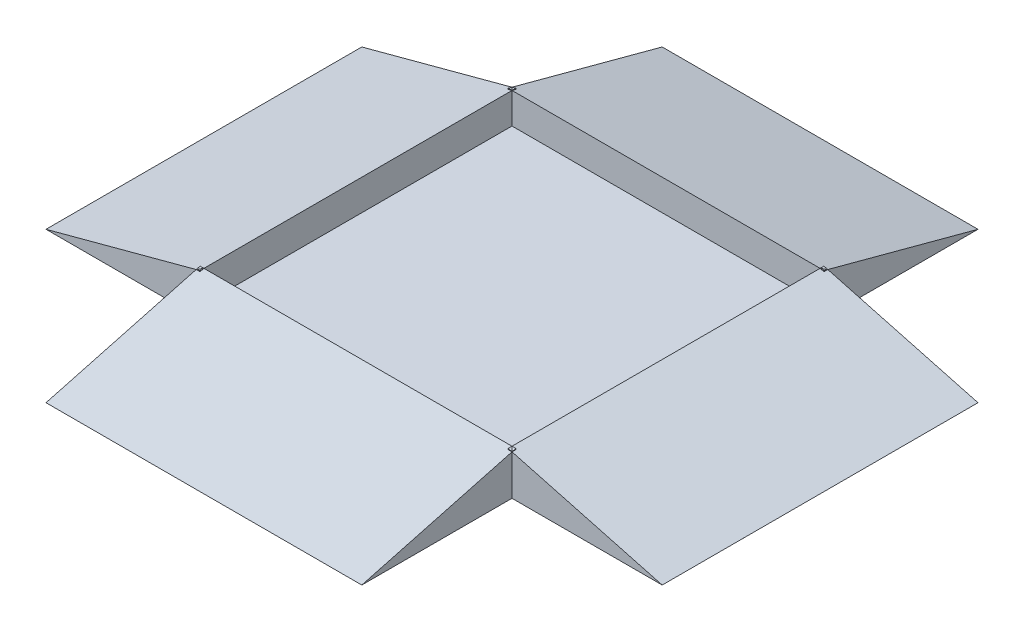
ISO-10303-21;
HEADER;
FILE_DESCRIPTION(('STEP AP214'),'2;1');
FILE_NAME('part.step','',(''),(''),'','','');
FILE_SCHEMA(('AUTOMOTIVE_DESIGN { 1 0 10303 214 1 1 1 1 }'));
ENDSEC;
DATA;
#1=APPLICATION_CONTEXT('core data for automotive mechanical design processes');
#2=APPLICATION_PROTOCOL_DEFINITION('international standard','automotive_design',2000,#1);
#3=PRODUCT_CONTEXT('',#1,'mechanical');
#4=PRODUCT('Part','Part','',(#3));
#5=PRODUCT_RELATED_PRODUCT_CATEGORY('part','',(#4));
#6=PRODUCT_DEFINITION_FORMATION('','',#4);
#7=PRODUCT_DEFINITION_CONTEXT('part definition',#1,'design');
#8=PRODUCT_DEFINITION('design','',#6,#7);
#9=PRODUCT_DEFINITION_SHAPE('','',#8);
#10=(LENGTH_UNIT() NAMED_UNIT(*) SI_UNIT(.MILLI.,.METRE.));
#11=(NAMED_UNIT(*) PLANE_ANGLE_UNIT() SI_UNIT($,.RADIAN.));
#12=(NAMED_UNIT(*) SI_UNIT($,.STERADIAN.) SOLID_ANGLE_UNIT());
#13=UNCERTAINTY_MEASURE_WITH_UNIT(LENGTH_MEASURE(1.E-05),#10,'distance_accuracy_value','');
#14=(GEOMETRIC_REPRESENTATION_CONTEXT(3) GLOBAL_UNCERTAINTY_ASSIGNED_CONTEXT((#13)) GLOBAL_UNIT_ASSIGNED_CONTEXT((#10,
#11,#12)) REPRESENTATION_CONTEXT('',''));
#15=CARTESIAN_POINT('',(0.,0.,0.));
#16=DIRECTION('',(0.,0.,1.));
#17=DIRECTION('',(1.,0.,0.));
#18=AXIS2_PLACEMENT_3D('',#15,#16,#17);
#19=CARTESIAN_POINT('',(102.5,6.79491924311158,0.));
#20=DIRECTION('',(0.,1.,0.));
#21=DIRECTION('',(0.,0.,1.));
#22=AXIS2_PLACEMENT_3D('',#19,#20,#21);
#23=PLANE('',#22);
#24=DIRECTION('',(0.,0.,1.));
#25=VECTOR('',#24,1.);
#26=CARTESIAN_POINT('',(100.000000000001,6.79491924311158,-102.499999999999));
#27=LINE('',#26,#25);
#28=CARTESIAN_POINT('',(100.000000000001,6.79491924311158,-100.));
#29=VERTEX_POINT('',#28);
#30=CARTESIAN_POINT('',(99.999999999999,6.79491924311158,99.9999999999999));
#31=VERTEX_POINT('',#30);
#32=EDGE_CURVE('E205',#29,#31,#27,.T.);
#33=ORIENTED_EDGE('',*,*,#32,.F.);
#34=DIRECTION('',(1.,0.,0.));
#35=VECTOR('',#34,1.);
#36=CARTESIAN_POINT('',(-102.5,6.79491924311158,-100.));
#37=LINE('',#36,#35);
#38=CARTESIAN_POINT('',(-99.9999999999997,6.79491924311158,-100.));
#39=VERTEX_POINT('',#38);
#40=EDGE_CURVE('E255',#39,#29,#37,.T.);
#41=ORIENTED_EDGE('',*,*,#40,.F.);
#42=DIRECTION('',(0.,0.,-1.));
#43=VECTOR('',#42,1.);
#44=CARTESIAN_POINT('',(-100.,6.79491924311158,102.5));
#45=LINE('',#44,#43);
#46=CARTESIAN_POINT('',(-100.,6.79491924311158,100.));
#47=VERTEX_POINT('',#46);
#48=EDGE_CURVE('E316',#47,#39,#45,.T.);
#49=ORIENTED_EDGE('',*,*,#48,.F.);
#50=DIRECTION('',(-1.,0.,0.));
#51=VECTOR('',#50,1.);
#52=CARTESIAN_POINT('',(102.5,6.79491924311158,100.));
#53=LINE('',#52,#51);
#54=EDGE_CURVE('E390',#31,#47,#53,.T.);
#55=ORIENTED_EDGE('',*,*,#54,.F.);
#56=EDGE_LOOP('',(#33,#41,#49,#55));
#57=FACE_BOUND('',#56,.T.);
#58=ADVANCED_FACE('F39',(#57),#23,.T.);
#59=CARTESIAN_POINT('',(102.5,0.,100.));
#60=DIRECTION('',(0.,0.,1.));
#61=DIRECTION('',(1.,0.,0.));
#62=AXIS2_PLACEMENT_3D('',#59,#60,#61);
#63=PLANE('',#62);
#64=DIRECTION('',(0.,-1.,0.));
#65=VECTOR('',#64,1.);
#66=CARTESIAN_POINT('',(-100.,0.,100.));
#67=LINE('',#66,#65);
#68=CARTESIAN_POINT('',(-100.,26.7949192431116,100.));
#69=VERTEX_POINT('',#68);
#70=EDGE_CURVE('E356',#69,#47,#67,.T.);
#71=ORIENTED_EDGE('',*,*,#70,.F.);
#72=DIRECTION('',(-1.,0.,0.));
#73=VECTOR('',#72,1.);
#74=CARTESIAN_POINT('',(102.5,26.7949192431116,100.));
#75=LINE('',#74,#73);
#76=CARTESIAN_POINT('',(99.9999999999989,26.7949192431116,100.));
#77=VERTEX_POINT('',#76);
#78=EDGE_CURVE('E391',#77,#69,#75,.T.);
#79=ORIENTED_EDGE('',*,*,#78,.F.);
#80=DIRECTION('',(0.,1.,0.));
#81=VECTOR('',#80,1.);
#82=CARTESIAN_POINT('',(99.999999999999,0.,100.));
#83=LINE('',#82,#81);
#84=EDGE_CURVE('E352',#31,#77,#83,.T.);
#85=ORIENTED_EDGE('',*,*,#84,.F.);
#86=ORIENTED_EDGE('',*,*,#54,.T.);
#87=EDGE_LOOP('',(#71,#79,#85,#86));
#88=FACE_BOUND('',#87,.T.);
#89=ADVANCED_FACE('F419',(#88),#63,.F.);
#90=CARTESIAN_POINT('',(102.5,49.9999999999989,13.3974596215555));
#91=DIRECTION('',(0.,0.96592582628907,0.258819045102515));
#92=DIRECTION('',(0.,-0.258819045102515,0.96592582628907));
#93=AXIS2_PLACEMENT_3D('',#90,#91,#92);
#94=PLANE('',#93);
#95=ORIENTED_EDGE('',*,*,#78,.T.);
#96=DIRECTION('',(0.,-0.258819045102515,0.96592582628907));
#97=VECTOR('',#96,1.);
#98=CARTESIAN_POINT('',(-100.,49.9999999999991,13.3974596215548));
#99=LINE('',#98,#97);
#100=CARTESIAN_POINT('',(-100.,26.1250462620338,102.5));
#101=VERTEX_POINT('',#100);
#102=EDGE_CURVE('E11',#69,#101,#99,.T.);
#103=ORIENTED_EDGE('',*,*,#102,.T.);
#104=DIRECTION('',(1.,0.,0.));
#105=VECTOR('',#104,1.);
#106=CARTESIAN_POINT('',(102.5,26.1250462620337,102.5));
#107=LINE('',#106,#105);
#108=CARTESIAN_POINT('',(-102.5,26.1250462620339,102.5));
#109=VERTEX_POINT('',#108);
#110=EDGE_CURVE('E331',#109,#101,#107,.T.);
#111=ORIENTED_EDGE('',*,*,#110,.F.);
#112=DIRECTION('',(0.,0.258819045102515,-0.96592582628907));
#113=VECTOR('',#112,1.);
#114=CARTESIAN_POINT('',(-102.5,49.9999999999989,13.3974596215555));
#115=LINE('',#114,#113);
#116=CARTESIAN_POINT('',(-102.5,0.,200.));
#117=VERTEX_POINT('',#116);
#118=EDGE_CURVE('E364',#117,#109,#115,.T.);
#119=ORIENTED_EDGE('',*,*,#118,.F.);
#120=DIRECTION('',(-1.,0.,0.));
#121=VECTOR('',#120,1.);
#122=CARTESIAN_POINT('',(102.5,0.,200.));
#123=LINE('',#122,#121);
#124=CARTESIAN_POINT('',(102.5,0.,200.));
#125=VERTEX_POINT('',#124);
#126=EDGE_CURVE('E373',#125,#117,#123,.T.);
#127=ORIENTED_EDGE('',*,*,#126,.F.);
#128=DIRECTION('',(0.,0.258819045102515,-0.96592582628907));
#129=VECTOR('',#128,1.);
#130=CARTESIAN_POINT('',(102.5,49.9999999999989,13.3974596215555));
#131=LINE('',#130,#129);
#132=CARTESIAN_POINT('',(102.5,26.1250462620335,102.500000000001));
#133=VERTEX_POINT('',#132);
#134=EDGE_CURVE('E369',#125,#133,#131,.T.);
#135=ORIENTED_EDGE('',*,*,#134,.T.);
#136=CARTESIAN_POINT('',(99.9999999999989,26.1250462620335,102.500000000001));
#137=VERTEX_POINT('',#136);
#138=EDGE_CURVE('E335',#137,#133,#107,.T.);
#139=ORIENTED_EDGE('',*,*,#138,.F.);
#140=DIRECTION('',(0.,0.258819045102515,-0.96592582628907));
#141=VECTOR('',#140,1.);
#142=CARTESIAN_POINT('',(99.9999999999999,49.9999999999989,13.3974596215555));
#143=LINE('',#142,#141);
#144=EDGE_CURVE('E48',#137,#77,#143,.T.);
#145=ORIENTED_EDGE('',*,*,#144,.T.);
#146=EDGE_LOOP('',(#95,#103,#111,#119,#127,#135,#139,#145));
#147=FACE_BOUND('',#146,.T.);
#148=ADVANCED_FACE('F411',(#147),#94,.T.);
#149=CARTESIAN_POINT('',(102.5,0.,0.));
#150=DIRECTION('',(1.,0.,0.));
#151=DIRECTION('',(0.,0.,-1.));
#152=AXIS2_PLACEMENT_3D('',#149,#150,#151);
#153=PLANE('',#152);
#154=DIRECTION('',(0.,-1.,0.));
#155=VECTOR('',#154,1.);
#156=CARTESIAN_POINT('',(102.5,0.,102.5));
#157=LINE('',#156,#155);
#158=CARTESIAN_POINT('',(102.5,0.,102.5));
#159=VERTEX_POINT('',#158);
#160=EDGE_CURVE('E334',#133,#159,#157,.T.);
#161=ORIENTED_EDGE('',*,*,#160,.F.);
#162=ORIENTED_EDGE('',*,*,#134,.F.);
#163=DIRECTION('',(0.,0.,1.));
#164=VECTOR('',#163,1.);
#165=CARTESIAN_POINT('',(102.5,0.,0.));
#166=LINE('',#165,#164);
#167=EDGE_CURVE('E360',#159,#125,#166,.T.);
#168=ORIENTED_EDGE('',*,*,#167,.F.);
#169=EDGE_LOOP('',(#161,#162,#168));
#170=FACE_BOUND('',#169,.T.);
#171=ADVANCED_FACE('F542',(#170),#153,.T.);
#172=CARTESIAN_POINT('',(102.5,0.,0.));
#173=DIRECTION('',(0.,-1.,0.));
#174=DIRECTION('',(0.,0.,-1.));
#175=AXIS2_PLACEMENT_3D('',#172,#173,#174);
#176=PLANE('',#175);
#177=DIRECTION('',(0.,0.,1.));
#178=VECTOR('',#177,1.);
#179=CARTESIAN_POINT('',(-102.5,0.,0.));
#180=LINE('',#179,#178);
#181=CARTESIAN_POINT('',(-102.5,0.,102.5));
#182=VERTEX_POINT('',#181);
#183=EDGE_CURVE('E359',#182,#117,#180,.T.);
#184=ORIENTED_EDGE('',*,*,#183,.F.);
#185=DIRECTION('',(-1.,0.,0.));
#186=VECTOR('',#185,1.);
#187=CARTESIAN_POINT('',(-3.57876837231421E-13,0.,102.5));
#188=LINE('',#187,#186);
#189=CARTESIAN_POINT('',(-200.,0.,102.499999999999));
#190=VERTEX_POINT('',#189);
#191=EDGE_CURVE('E288',#182,#190,#188,.T.);
#192=ORIENTED_EDGE('',*,*,#191,.T.);
#193=DIRECTION('',(0.,0.,-1.));
#194=VECTOR('',#193,1.);
#195=CARTESIAN_POINT('',(-200.,0.,102.499999999999));
#196=LINE('',#195,#194);
#197=CARTESIAN_POINT('',(-200.,0.,-102.500000000001));
#198=VERTEX_POINT('',#197);
#199=EDGE_CURVE('E297',#190,#198,#196,.T.);
#200=ORIENTED_EDGE('',*,*,#199,.T.);
#201=DIRECTION('',(-1.,0.,0.));
#202=VECTOR('',#201,1.);
#203=CARTESIAN_POINT('',(3.57876837231421E-13,0.,-102.5));
#204=LINE('',#203,#202);
#205=CARTESIAN_POINT('',(-102.5,0.,-102.5));
#206=VERTEX_POINT('',#205);
#207=EDGE_CURVE('E283',#206,#198,#204,.T.);
#208=ORIENTED_EDGE('',*,*,#207,.F.);
#209=DIRECTION('',(0.,0.,-1.));
#210=VECTOR('',#209,1.);
#211=CARTESIAN_POINT('',(-102.5,0.,0.));
#212=LINE('',#211,#210);
#213=CARTESIAN_POINT('',(-102.5,0.,-200.));
#214=VERTEX_POINT('',#213);
#215=EDGE_CURVE('E497',#206,#214,#212,.T.);
#216=ORIENTED_EDGE('',*,*,#215,.T.);
#217=DIRECTION('',(1.,0.,0.));
#218=VECTOR('',#217,1.);
#219=CARTESIAN_POINT('',(-102.5,0.,-200.));
#220=LINE('',#219,#218);
#221=CARTESIAN_POINT('',(102.5,0.,-200.));
#222=VERTEX_POINT('',#221);
#223=EDGE_CURVE('E505',#214,#222,#220,.T.);
#224=ORIENTED_EDGE('',*,*,#223,.T.);
#225=DIRECTION('',(0.,0.,-1.));
#226=VECTOR('',#225,1.);
#227=CARTESIAN_POINT('',(102.5,0.,0.));
#228=LINE('',#227,#226);
#229=CARTESIAN_POINT('',(102.5,0.,-102.499999999999));
#230=VERTEX_POINT('',#229);
#231=EDGE_CURVE('E241',#230,#222,#228,.T.);
#232=ORIENTED_EDGE('',*,*,#231,.F.);
#233=DIRECTION('',(1.,0.,0.));
#234=VECTOR('',#233,1.);
#235=CARTESIAN_POINT('',(1.07363051169426E-12,0.,-102.5));
#236=LINE('',#235,#234);
#237=CARTESIAN_POINT('',(200.000000000001,0.,-102.499999999998));
#238=VERTEX_POINT('',#237);
#239=EDGE_CURVE('E199',#230,#238,#236,.T.);
#240=ORIENTED_EDGE('',*,*,#239,.T.);
#241=DIRECTION('',(0.,0.,1.));
#242=VECTOR('',#241,1.);
#243=CARTESIAN_POINT('',(200.000000000001,0.,-102.499999999998));
#244=LINE('',#243,#242);
#245=CARTESIAN_POINT('',(199.999999999999,0.,102.500000000002));
#246=VERTEX_POINT('',#245);
#247=EDGE_CURVE('E215',#238,#246,#244,.T.);
#248=ORIENTED_EDGE('',*,*,#247,.T.);
#249=EDGE_CURVE('E284',#246,#159,#188,.T.);
#250=ORIENTED_EDGE('',*,*,#249,.T.);
#251=ORIENTED_EDGE('',*,*,#167,.T.);
#252=ORIENTED_EDGE('',*,*,#126,.T.);
#253=EDGE_LOOP('',(#184,#192,#200,#208,#216,#224,#232,#240,#248,#250,#251,#252));
#254=FACE_BOUND('',#253,.T.);
#255=ADVANCED_FACE('F41',(#254),#176,.T.);
#256=CARTESIAN_POINT('',(-102.5,0.,0.));
#257=DIRECTION('',(1.,0.,0.));
#258=DIRECTION('',(0.,0.,-1.));
#259=AXIS2_PLACEMENT_3D('',#256,#257,#258);
#260=PLANE('',#259);
#261=ORIENTED_EDGE('',*,*,#118,.T.);
#262=DIRECTION('',(0.,-1.,0.));
#263=VECTOR('',#262,1.);
#264=CARTESIAN_POINT('',(-102.5,0.,102.5));
#265=LINE('',#264,#263);
#266=EDGE_CURVE('E395',#109,#182,#265,.T.);
#267=ORIENTED_EDGE('',*,*,#266,.T.);
#268=ORIENTED_EDGE('',*,*,#183,.T.);
#269=EDGE_LOOP('',(#261,#267,#268));
#270=FACE_BOUND('',#269,.T.);
#271=ADVANCED_FACE('F576',(#270),#260,.F.);
#272=CARTESIAN_POINT('',(-102.5,0.,0.));
#273=DIRECTION('',(-1.,0.,0.));
#274=DIRECTION('',(0.,0.,1.));
#275=AXIS2_PLACEMENT_3D('',#272,#273,#274);
#276=PLANE('',#275);
#277=DIRECTION('',(0.,0.258819045102515,0.96592582628907));
#278=VECTOR('',#277,1.);
#279=CARTESIAN_POINT('',(-102.5,49.9999999999989,-13.3974596215555));
#280=LINE('',#279,#278);
#281=CARTESIAN_POINT('',(-102.5,26.1250462620337,-102.5));
#282=VERTEX_POINT('',#281);
#283=CARTESIAN_POINT('',(-102.5,26.7949192431116,-100.));
#284=VERTEX_POINT('',#283);
#285=EDGE_CURVE('E464',#282,#284,#280,.T.);
#286=ORIENTED_EDGE('',*,*,#285,.F.);
#287=DIRECTION('',(0.,0.,1.));
#288=VECTOR('',#287,1.);
#289=CARTESIAN_POINT('',(-102.5,26.1250462620339,102.5));
#290=LINE('',#289,#288);
#291=CARTESIAN_POINT('',(-102.5,26.1250462620337,-100.));
#292=VERTEX_POINT('',#291);
#293=EDGE_CURVE('E268',#282,#292,#290,.T.);
#294=ORIENTED_EDGE('',*,*,#293,.T.);
#295=DIRECTION('',(0.,1.,0.));
#296=VECTOR('',#295,1.);
#297=CARTESIAN_POINT('',(-102.5,0.,-100.));
#298=LINE('',#297,#296);
#299=EDGE_CURVE('E471',#292,#284,#298,.T.);
#300=ORIENTED_EDGE('',*,*,#299,.T.);
#301=EDGE_LOOP('',(#286,#294,#300));
#302=FACE_BOUND('',#301,.T.);
#303=ADVANCED_FACE('F579',(#302),#276,.T.);
#304=CARTESIAN_POINT('',(-102.5,49.9999999999989,-13.3974596215555));
#305=DIRECTION('',(0.,0.96592582628907,-0.258819045102515));
#306=DIRECTION('',(0.,0.258819045102515,0.96592582628907));
#307=AXIS2_PLACEMENT_3D('',#304,#305,#306);
#308=PLANE('',#307);
#309=DIRECTION('',(1.,0.,0.));
#310=VECTOR('',#309,1.);
#311=CARTESIAN_POINT('',(-102.5,26.7949192431116,-100.));
#312=LINE('',#311,#310);
#313=CARTESIAN_POINT('',(-99.9999999999997,26.7949192431116,-100.));
#314=VERTEX_POINT('',#313);
#315=EDGE_CURVE('E262',#284,#314,#312,.T.);
#316=ORIENTED_EDGE('',*,*,#315,.T.);
#317=DIRECTION('',(-0.694746590606865,-0.186156787897381,-0.694746590606868));
#318=VECTOR('',#317,1.);
#319=CARTESIAN_POINT('',(42.5430946428319,64.9892263392905,42.543094642832));
#320=LINE('',#319,#318);
#321=EDGE_CURVE('E271',#314,#282,#320,.T.);
#322=ORIENTED_EDGE('',*,*,#321,.T.);
#323=ORIENTED_EDGE('',*,*,#285,.T.);
#324=EDGE_LOOP('',(#316,#322,#323));
#325=FACE_BOUND('',#324,.T.);
#326=ADVANCED_FACE('F462',(#325),#308,.T.);
#327=CARTESIAN_POINT('',(-102.5,0.,-100.));
#328=DIRECTION('',(0.,0.,-1.));
#329=DIRECTION('',(-1.,0.,0.));
#330=AXIS2_PLACEMENT_3D('',#327,#328,#329);
#331=PLANE('',#330);
#332=DIRECTION('',(-0.96592582628907,-0.258819045102515,0.));
#333=VECTOR('',#332,1.);
#334=CARTESIAN_POINT('',(-13.3974596215558,49.9999999999987,-100.));
#335=LINE('',#334,#333);
#336=EDGE_CURVE('E327',#314,#292,#335,.T.);
#337=ORIENTED_EDGE('',*,*,#336,.F.);
#338=ORIENTED_EDGE('',*,*,#315,.F.);
#339=ORIENTED_EDGE('',*,*,#299,.F.);
#340=EDGE_LOOP('',(#337,#338,#339));
#341=FACE_BOUND('',#340,.T.);
#342=ADVANCED_FACE('F470',(#341),#331,.F.);
#343=CARTESIAN_POINT('',(-100.,0.,102.5));
#344=DIRECTION('',(-1.,0.,0.));
#345=DIRECTION('',(0.,0.,1.));
#346=AXIS2_PLACEMENT_3D('',#343,#344,#345);
#347=PLANE('',#346);
#348=DIRECTION('',(0.,0.,-1.));
#349=VECTOR('',#348,1.);
#350=CARTESIAN_POINT('',(-100.,26.7949192431116,102.5));
#351=LINE('',#350,#349);
#352=CARTESIAN_POINT('',(-99.9999999999996,26.7949192431116,-102.5));
#353=VERTEX_POINT('',#352);
#354=EDGE_CURVE('E311',#314,#353,#351,.T.);
#355=ORIENTED_EDGE('',*,*,#354,.F.);
#356=DIRECTION('',(0.,-0.258819045102515,-0.96592582628907));
#357=VECTOR('',#356,1.);
#358=CARTESIAN_POINT('',(-100.,75.6249999999982,82.236342322397));
#359=LINE('',#358,#357);
#360=CARTESIAN_POINT('',(-99.9999999999996,26.1250462620337,-102.5));
#361=VERTEX_POINT('',#360);
#362=EDGE_CURVE('E275',#314,#361,#359,.T.);
#363=ORIENTED_EDGE('',*,*,#362,.T.);
#364=DIRECTION('',(0.,1.,0.));
#365=VECTOR('',#364,1.);
#366=CARTESIAN_POINT('',(-99.9999999999996,0.,-102.5));
#367=LINE('',#366,#365);
#368=EDGE_CURVE('E300',#361,#353,#367,.T.);
#369=ORIENTED_EDGE('',*,*,#368,.T.);
#370=EDGE_LOOP('',(#355,#363,#369));
#371=FACE_BOUND('',#370,.T.);
#372=ADVANCED_FACE('F450',(#371),#347,.F.);
#373=CARTESIAN_POINT('',(-13.3974596215559,49.9999999999989,102.5));
#374=DIRECTION('',(-0.258819045102515,0.96592582628907,0.));
#375=DIRECTION('',(-0.96592582628907,-0.258819045102515,0.));
#376=AXIS2_PLACEMENT_3D('',#373,#374,#375);
#377=PLANE('',#376);
#378=ORIENTED_EDGE('',*,*,#321,.F.);
#379=ORIENTED_EDGE('',*,*,#354,.T.);
#380=DIRECTION('',(0.96592582628907,0.258819045102515,0.));
#381=VECTOR('',#380,1.);
#382=CARTESIAN_POINT('',(-13.3974596215551,49.9999999999989,-102.5));
#383=LINE('',#382,#381);
#384=EDGE_CURVE('E304',#282,#353,#383,.T.);
#385=ORIENTED_EDGE('',*,*,#384,.F.);
#386=EDGE_LOOP('',(#378,#379,#385));
#387=FACE_BOUND('',#386,.T.);
#388=ADVANCED_FACE('F447',(#387),#377,.T.);
#389=CARTESIAN_POINT('',(3.57876837231421E-13,0.,-102.5));
#390=DIRECTION('',(0.,0.,1.));
#391=DIRECTION('',(1.,0.,0.));
#392=AXIS2_PLACEMENT_3D('',#389,#390,#391);
#393=PLANE('',#392);
#394=ORIENTED_EDGE('',*,*,#368,.F.);
#395=DIRECTION('',(-1.,0.,0.));
#396=VECTOR('',#395,1.);
#397=CARTESIAN_POINT('',(3.334358217674E-13,26.1250462620338,-102.5));
#398=LINE('',#397,#396);
#399=EDGE_CURVE('E323',#361,#282,#398,.T.);
#400=ORIENTED_EDGE('',*,*,#399,.T.);
#401=ORIENTED_EDGE('',*,*,#384,.T.);
#402=EDGE_LOOP('',(#394,#400,#401));
#403=FACE_BOUND('',#402,.T.);
#404=ADVANCED_FACE('F444',(#403),#393,.F.);
#405=CARTESIAN_POINT('',(100.000000000001,26.7949192431116,-100.));
#406=VERTEX_POINT('',#405);
#407=EDGE_CURVE('E456',#314,#406,#312,.T.);
#408=ORIENTED_EDGE('',*,*,#407,.F.);
#409=DIRECTION('',(0.,-1.,0.));
#410=VECTOR('',#409,1.);
#411=CARTESIAN_POINT('',(-99.9999999999997,0.,-100.));
#412=LINE('',#411,#410);
#413=EDGE_CURVE('E279',#314,#39,#412,.T.);
#414=ORIENTED_EDGE('',*,*,#413,.T.);
#415=ORIENTED_EDGE('',*,*,#40,.T.);
#416=DIRECTION('',(0.,-1.,0.));
#417=VECTOR('',#416,1.);
#418=CARTESIAN_POINT('',(100.000000000001,0.,-100.));
#419=LINE('',#418,#417);
#420=EDGE_CURVE('E483',#406,#29,#419,.T.);
#421=ORIENTED_EDGE('',*,*,#420,.F.);
#422=EDGE_LOOP('',(#408,#414,#415,#421));
#423=FACE_BOUND('',#422,.T.);
#424=ADVANCED_FACE('F478',(#423),#331,.F.);
#425=ORIENTED_EDGE('',*,*,#362,.F.);
#426=ORIENTED_EDGE('',*,*,#407,.T.);
#427=DIRECTION('',(0.,-0.258819045102515,-0.96592582628907));
#428=VECTOR('',#427,1.);
#429=CARTESIAN_POINT('',(100.,49.9999999999994,-13.3974596215535));
#430=LINE('',#429,#428);
#431=CARTESIAN_POINT('',(100.000000000001,26.1250462620339,-102.499999999999));
#432=VERTEX_POINT('',#431);
#433=EDGE_CURVE('E202',#406,#432,#430,.T.);
#434=ORIENTED_EDGE('',*,*,#433,.T.);
#435=DIRECTION('',(-1.,0.,0.));
#436=VECTOR('',#435,1.);
#437=CARTESIAN_POINT('',(-102.499999999999,26.1250462620335,-102.500000000001));
#438=LINE('',#437,#436);
#439=CARTESIAN_POINT('',(102.5,26.1250462620341,-102.499999999999));
#440=VERTEX_POINT('',#439);
#441=EDGE_CURVE('E195',#440,#432,#438,.T.);
#442=ORIENTED_EDGE('',*,*,#441,.F.);
#443=DIRECTION('',(0.,0.258819045102515,0.96592582628907));
#444=VECTOR('',#443,1.);
#445=CARTESIAN_POINT('',(102.5,49.9999999999989,-13.3974596215555));
#446=LINE('',#445,#444);
#447=EDGE_CURVE('E500',#222,#440,#446,.T.);
#448=ORIENTED_EDGE('',*,*,#447,.F.);
#449=ORIENTED_EDGE('',*,*,#223,.F.);
#450=EDGE_CURVE('E503',#214,#282,#280,.T.);
#451=ORIENTED_EDGE('',*,*,#450,.T.);
#452=ORIENTED_EDGE('',*,*,#399,.F.);
#453=EDGE_LOOP('',(#425,#426,#434,#442,#448,#449,#451,#452));
#454=FACE_BOUND('',#453,.T.);
#455=ADVANCED_FACE('F454',(#454),#308,.T.);
#456=DIRECTION('',(0.,-1.,0.));
#457=VECTOR('',#456,1.);
#458=CARTESIAN_POINT('',(-102.5,0.,-102.5));
#459=LINE('',#458,#457);
#460=EDGE_CURVE('E319',#282,#206,#459,.T.);
#461=ORIENTED_EDGE('',*,*,#460,.F.);
#462=ORIENTED_EDGE('',*,*,#450,.F.);
#463=ORIENTED_EDGE('',*,*,#215,.F.);
#464=EDGE_LOOP('',(#461,#462,#463));
#465=FACE_BOUND('',#464,.T.);
#466=ADVANCED_FACE('F599',(#465),#276,.T.);
#467=CARTESIAN_POINT('',(102.5,0.,0.));
#468=DIRECTION('',(-1.,0.,0.));
#469=DIRECTION('',(0.,0.,1.));
#470=AXIS2_PLACEMENT_3D('',#467,#468,#469);
#471=PLANE('',#470);
#472=ORIENTED_EDGE('',*,*,#447,.T.);
#473=DIRECTION('',(0.,-1.,0.));
#474=VECTOR('',#473,1.);
#475=CARTESIAN_POINT('',(102.5,0.,-102.499999999999));
#476=LINE('',#475,#474);
#477=EDGE_CURVE('E251',#440,#230,#476,.T.);
#478=ORIENTED_EDGE('',*,*,#477,.T.);
#479=ORIENTED_EDGE('',*,*,#231,.T.);
#480=EDGE_LOOP('',(#472,#478,#479));
#481=FACE_BOUND('',#480,.T.);
#482=ADVANCED_FACE('F612',(#481),#471,.F.);
#483=CARTESIAN_POINT('',(1.07363051169426E-12,0.,-102.5));
#484=DIRECTION('',(0.,0.,-1.));
#485=DIRECTION('',(-1.,0.,0.));
#486=AXIS2_PLACEMENT_3D('',#483,#484,#485);
#487=PLANE('',#486);
#488=ORIENTED_EDGE('',*,*,#477,.F.);
#489=DIRECTION('',(-0.96592582628907,0.258819045102515,0.));
#490=VECTOR('',#489,1.);
#491=CARTESIAN_POINT('',(13.3974596215566,49.9999999999989,-102.5));
#492=LINE('',#491,#490);
#493=EDGE_CURVE('E189',#238,#440,#492,.T.);
#494=ORIENTED_EDGE('',*,*,#493,.F.);
#495=ORIENTED_EDGE('',*,*,#239,.F.);
#496=EDGE_LOOP('',(#488,#494,#495));
#497=FACE_BOUND('',#496,.T.);
#498=ADVANCED_FACE('F250',(#497),#487,.T.);
#499=DIRECTION('',(0.,1.,0.));
#500=VECTOR('',#499,1.);
#501=CARTESIAN_POINT('',(102.5,0.,-100.));
#502=LINE('',#501,#500);
#503=CARTESIAN_POINT('',(102.5,26.1250462620341,-100.));
#504=VERTEX_POINT('',#503);
#505=CARTESIAN_POINT('',(102.5,26.7949192431116,-100.));
#506=VERTEX_POINT('',#505);
#507=EDGE_CURVE('E491',#504,#506,#502,.T.);
#508=ORIENTED_EDGE('',*,*,#507,.F.);
#509=DIRECTION('',(0.,0.,-1.));
#510=VECTOR('',#509,1.);
#511=CARTESIAN_POINT('',(102.5,26.1250462620338,0.));
#512=LINE('',#511,#510);
#513=EDGE_CURVE('E254',#504,#440,#512,.T.);
#514=ORIENTED_EDGE('',*,*,#513,.T.);
#515=EDGE_CURVE('E510',#440,#506,#446,.T.);
#516=ORIENTED_EDGE('',*,*,#515,.T.);
#517=EDGE_LOOP('',(#508,#514,#516));
#518=FACE_BOUND('',#517,.T.);
#519=ADVANCED_FACE('F525',(#518),#471,.F.);
#520=DIRECTION('',(0.69474659060687,-0.18615678789738,-0.694746590606863));
#521=VECTOR('',#520,1.);
#522=CARTESIAN_POINT('',(-42.5430946428326,64.9892263392906,42.5430946428321));
#523=LINE('',#522,#521);
#524=EDGE_CURVE('E185',#406,#440,#523,.T.);
#525=ORIENTED_EDGE('',*,*,#524,.F.);
#526=EDGE_CURVE('E469',#406,#506,#312,.T.);
#527=ORIENTED_EDGE('',*,*,#526,.T.);
#528=ORIENTED_EDGE('',*,*,#515,.F.);
#529=EDGE_LOOP('',(#525,#527,#528));
#530=FACE_BOUND('',#529,.T.);
#531=ADVANCED_FACE('F519',(#530),#308,.T.);
#532=ORIENTED_EDGE('',*,*,#526,.F.);
#533=DIRECTION('',(0.96592582628907,-0.258819045102515,0.));
#534=VECTOR('',#533,1.);
#535=CARTESIAN_POINT('',(-82.2363423223972,75.6249999999986,-100.));
#536=LINE('',#535,#534);
#537=EDGE_CURVE('E487',#406,#504,#536,.T.);
#538=ORIENTED_EDGE('',*,*,#537,.T.);
#539=ORIENTED_EDGE('',*,*,#507,.T.);
#540=EDGE_LOOP('',(#532,#538,#539));
#541=FACE_BOUND('',#540,.T.);
#542=ADVANCED_FACE('F523',(#541),#331,.F.);
#543=CARTESIAN_POINT('',(100.000000000001,0.,-102.499999999999));
#544=DIRECTION('',(1.,0.,0.));
#545=DIRECTION('',(0.,0.,-1.));
#546=AXIS2_PLACEMENT_3D('',#543,#544,#545);
#547=PLANE('',#546);
#548=ORIENTED_EDGE('',*,*,#433,.F.);
#549=DIRECTION('',(0.,0.,1.));
#550=VECTOR('',#549,1.);
#551=CARTESIAN_POINT('',(100.000000000001,26.7949192431116,-102.499999999999));
#552=LINE('',#551,#550);
#553=CARTESIAN_POINT('',(100.000000000001,26.7949192431116,-102.499999999999));
#554=VERTEX_POINT('',#553);
#555=EDGE_CURVE('E182',#554,#406,#552,.T.);
#556=ORIENTED_EDGE('',*,*,#555,.F.);
#557=DIRECTION('',(0.,1.,0.));
#558=VECTOR('',#557,1.);
#559=CARTESIAN_POINT('',(100.000000000001,0.,-102.499999999999));
#560=LINE('',#559,#558);
#561=EDGE_CURVE('E190',#432,#554,#560,.T.);
#562=ORIENTED_EDGE('',*,*,#561,.F.);
#563=EDGE_LOOP('',(#548,#556,#562));
#564=FACE_BOUND('',#563,.T.);
#565=ADVANCED_FACE('F201',(#564),#547,.F.);
#566=CARTESIAN_POINT('',(13.3974596215566,49.9999999999989,-102.5));
#567=DIRECTION('',(0.258819045102515,0.96592582628907,0.));
#568=DIRECTION('',(-0.96592582628907,0.258819045102515,0.));
#569=AXIS2_PLACEMENT_3D('',#566,#567,#568);
#570=PLANE('',#569);
#571=ORIENTED_EDGE('',*,*,#555,.T.);
#572=ORIENTED_EDGE('',*,*,#524,.T.);
#573=EDGE_CURVE('E178',#440,#554,#492,.T.);
#574=ORIENTED_EDGE('',*,*,#573,.T.);
#575=EDGE_LOOP('',(#571,#572,#574));
#576=FACE_BOUND('',#575,.T.);
#577=ADVANCED_FACE('F180',(#576),#570,.T.);
#578=ORIENTED_EDGE('',*,*,#573,.F.);
#579=ORIENTED_EDGE('',*,*,#441,.T.);
#580=ORIENTED_EDGE('',*,*,#561,.T.);
#581=EDGE_LOOP('',(#578,#579,#580));
#582=FACE_BOUND('',#581,.T.);
#583=ADVANCED_FACE('F193',(#582),#487,.T.);
#584=EDGE_CURVE('E305',#198,#282,#383,.T.);
#585=ORIENTED_EDGE('',*,*,#584,.T.);
#586=ORIENTED_EDGE('',*,*,#460,.T.);
#587=ORIENTED_EDGE('',*,*,#207,.T.);
#588=EDGE_LOOP('',(#585,#586,#587));
#589=FACE_BOUND('',#588,.T.);
#590=ADVANCED_FACE('F558',(#589),#393,.F.);
#591=CARTESIAN_POINT('',(-3.57876837231421E-13,0.,102.5));
#592=DIRECTION('',(0.,0.,1.));
#593=DIRECTION('',(1.,0.,0.));
#594=AXIS2_PLACEMENT_3D('',#591,#592,#593);
#595=PLANE('',#594);
#596=ORIENTED_EDGE('',*,*,#266,.F.);
#597=DIRECTION('',(0.96592582628907,0.258819045102515,0.));
#598=VECTOR('',#597,1.);
#599=CARTESIAN_POINT('',(-13.3974596215559,49.9999999999989,102.5));
#600=LINE('',#599,#598);
#601=EDGE_CURVE('E293',#190,#109,#600,.T.);
#602=ORIENTED_EDGE('',*,*,#601,.F.);
#603=ORIENTED_EDGE('',*,*,#191,.F.);
#604=EDGE_LOOP('',(#596,#602,#603));
#605=FACE_BOUND('',#604,.T.);
#606=ADVANCED_FACE('F550',(#605),#595,.T.);
#607=DIRECTION('',(-0.96592582628907,0.258819045102515,0.));
#608=VECTOR('',#607,1.);
#609=CARTESIAN_POINT('',(13.3974596215544,49.9999999999989,102.5));
#610=LINE('',#609,#608);
#611=EDGE_CURVE('E229',#246,#133,#610,.T.);
#612=ORIENTED_EDGE('',*,*,#611,.T.);
#613=ORIENTED_EDGE('',*,*,#160,.T.);
#614=ORIENTED_EDGE('',*,*,#249,.F.);
#615=EDGE_LOOP('',(#612,#613,#614));
#616=FACE_BOUND('',#615,.T.);
#617=ADVANCED_FACE('F547',(#616),#595,.T.);
#618=DIRECTION('',(-0.96592582628907,-0.258819045102515,0.));
#619=VECTOR('',#618,1.);
#620=CARTESIAN_POINT('',(82.2363423223973,75.6249999999984,100.));
#621=LINE('',#620,#619);
#622=CARTESIAN_POINT('',(-102.5,26.1250462620339,100.));
#623=VERTEX_POINT('',#622);
#624=EDGE_CURVE('E342',#69,#623,#621,.T.);
#625=ORIENTED_EDGE('',*,*,#624,.F.);
#626=EDGE_CURVE('E63',#69,#314,#351,.T.);
#627=ORIENTED_EDGE('',*,*,#626,.T.);
#628=ORIENTED_EDGE('',*,*,#336,.T.);
#629=ORIENTED_EDGE('',*,*,#293,.F.);
#630=ORIENTED_EDGE('',*,*,#584,.F.);
#631=ORIENTED_EDGE('',*,*,#199,.F.);
#632=ORIENTED_EDGE('',*,*,#601,.T.);
#633=DIRECTION('',(0.,0.,1.));
#634=VECTOR('',#633,1.);
#635=CARTESIAN_POINT('',(-102.5,26.1250462620338,0.));
#636=LINE('',#635,#634);
#637=EDGE_CURVE('E399',#623,#109,#636,.T.);
#638=ORIENTED_EDGE('',*,*,#637,.F.);
#639=EDGE_LOOP('',(#625,#627,#628,#629,#630,#631,#632,#638));
#640=FACE_BOUND('',#639,.T.);
#641=ADVANCED_FACE('F549',(#640),#377,.T.);
#642=DIRECTION('',(-0.96592582628907,0.258819045102515,0.));
#643=VECTOR('',#642,1.);
#644=CARTESIAN_POINT('',(109.031261565508,24.3749999999992,100.));
#645=LINE('',#644,#643);
#646=CARTESIAN_POINT('',(102.5,26.1250462620336,100.));
#647=VERTEX_POINT('',#646);
#648=EDGE_CURVE('E348',#647,#77,#645,.T.);
#649=ORIENTED_EDGE('',*,*,#648,.F.);
#650=DIRECTION('',(0.,0.,1.));
#651=VECTOR('',#650,1.);
#652=CARTESIAN_POINT('',(102.5,26.1250462620338,0.));
#653=LINE('',#652,#651);
#654=EDGE_CURVE('E403',#647,#133,#653,.T.);
#655=ORIENTED_EDGE('',*,*,#654,.T.);
#656=ORIENTED_EDGE('',*,*,#611,.F.);
#657=ORIENTED_EDGE('',*,*,#247,.F.);
#658=ORIENTED_EDGE('',*,*,#493,.T.);
#659=ORIENTED_EDGE('',*,*,#513,.F.);
#660=ORIENTED_EDGE('',*,*,#537,.F.);
#661=EDGE_CURVE('E206',#406,#77,#552,.T.);
#662=ORIENTED_EDGE('',*,*,#661,.T.);
#663=EDGE_LOOP('',(#649,#655,#656,#657,#658,#659,#660,#662));
#664=FACE_BOUND('',#663,.T.);
#665=ADVANCED_FACE('F248',(#664),#570,.T.);
#666=ORIENTED_EDGE('',*,*,#32,.T.);
#667=ORIENTED_EDGE('',*,*,#84,.T.);
#668=ORIENTED_EDGE('',*,*,#661,.F.);
#669=ORIENTED_EDGE('',*,*,#420,.T.);
#670=EDGE_LOOP('',(#666,#667,#668,#669));
#671=FACE_BOUND('',#670,.T.);
#672=ADVANCED_FACE('F482',(#671),#547,.F.);
#673=ORIENTED_EDGE('',*,*,#626,.F.);
#674=ORIENTED_EDGE('',*,*,#70,.T.);
#675=ORIENTED_EDGE('',*,*,#48,.T.);
#676=ORIENTED_EDGE('',*,*,#413,.F.);
#677=EDGE_LOOP('',(#673,#674,#675,#676));
#678=FACE_BOUND('',#677,.T.);
#679=ADVANCED_FACE('F474',(#678),#347,.F.);
#680=DIRECTION('',(0.,1.,0.));
#681=VECTOR('',#680,1.);
#682=CARTESIAN_POINT('',(-102.5,0.,100.));
#683=LINE('',#682,#681);
#684=CARTESIAN_POINT('',(-102.5,26.7949192431116,100.));
#685=VERTEX_POINT('',#684);
#686=EDGE_CURVE('E376',#623,#685,#683,.T.);
#687=ORIENTED_EDGE('',*,*,#686,.F.);
#688=ORIENTED_EDGE('',*,*,#637,.T.);
#689=EDGE_CURVE('E380',#109,#685,#115,.T.);
#690=ORIENTED_EDGE('',*,*,#689,.T.);
#691=EDGE_LOOP('',(#687,#688,#690));
#692=FACE_BOUND('',#691,.T.);
#693=ADVANCED_FACE('F432',(#692),#260,.F.);
#694=DIRECTION('',(-0.694746590606867,-0.186156787897381,0.694746590606865));
#695=VECTOR('',#694,1.);
#696=CARTESIAN_POINT('',(42.5430946428322,64.9892263392906,-42.5430946428321));
#697=LINE('',#696,#695);
#698=EDGE_CURVE('E338',#69,#109,#697,.T.);
#699=ORIENTED_EDGE('',*,*,#698,.F.);
#700=EDGE_CURVE('E386',#69,#685,#75,.T.);
#701=ORIENTED_EDGE('',*,*,#700,.T.);
#702=ORIENTED_EDGE('',*,*,#689,.F.);
#703=EDGE_LOOP('',(#699,#701,#702));
#704=FACE_BOUND('',#703,.T.);
#705=ADVANCED_FACE('F426',(#704),#94,.T.);
#706=ORIENTED_EDGE('',*,*,#700,.F.);
#707=ORIENTED_EDGE('',*,*,#624,.T.);
#708=ORIENTED_EDGE('',*,*,#686,.T.);
#709=EDGE_LOOP('',(#706,#707,#708));
#710=FACE_BOUND('',#709,.T.);
#711=ADVANCED_FACE('F430',(#710),#63,.F.);
#712=ORIENTED_EDGE('',*,*,#654,.F.);
#713=DIRECTION('',(0.,1.,0.));
#714=VECTOR('',#713,1.);
#715=CARTESIAN_POINT('',(102.5,0.,100.));
#716=LINE('',#715,#714);
#717=CARTESIAN_POINT('',(102.5,26.7949192431116,100.));
#718=VERTEX_POINT('',#717);
#719=EDGE_CURVE('E363',#647,#718,#716,.T.);
#720=ORIENTED_EDGE('',*,*,#719,.T.);
#721=EDGE_CURVE('E368',#133,#718,#131,.T.);
#722=ORIENTED_EDGE('',*,*,#721,.F.);
#723=EDGE_LOOP('',(#712,#720,#722));
#724=FACE_BOUND('',#723,.T.);
#725=ADVANCED_FACE('F575',(#724),#153,.T.);
#726=DIRECTION('',(-0.694746590606863,0.186156787897382,-0.69474659060687));
#727=VECTOR('',#726,1.);
#728=CARTESIAN_POINT('',(56.4048345149397,38.4762086287342,56.4048345149403));
#729=LINE('',#728,#727);
#730=EDGE_CURVE('E55',#133,#77,#729,.T.);
#731=ORIENTED_EDGE('',*,*,#730,.F.);
#732=ORIENTED_EDGE('',*,*,#721,.T.);
#733=EDGE_CURVE('E387',#718,#77,#75,.T.);
#734=ORIENTED_EDGE('',*,*,#733,.T.);
#735=EDGE_LOOP('',(#731,#732,#734));
#736=FACE_BOUND('',#735,.T.);
#737=ADVANCED_FACE('F572',(#736),#94,.T.);
#738=ORIENTED_EDGE('',*,*,#719,.F.);
#739=ORIENTED_EDGE('',*,*,#648,.T.);
#740=ORIENTED_EDGE('',*,*,#733,.F.);
#741=EDGE_LOOP('',(#738,#739,#740));
#742=FACE_BOUND('',#741,.T.);
#743=ADVANCED_FACE('F531',(#742),#63,.F.);
#744=CARTESIAN_POINT('',(99.9999999999989,26.7949192431116,102.500000000001));
#745=VERTEX_POINT('',#744);
#746=EDGE_CURVE('E233',#133,#745,#610,.T.);
#747=ORIENTED_EDGE('',*,*,#746,.F.);
#748=ORIENTED_EDGE('',*,*,#730,.T.);
#749=EDGE_CURVE('E208',#77,#745,#552,.T.);
#750=ORIENTED_EDGE('',*,*,#749,.T.);
#751=EDGE_LOOP('',(#747,#748,#750));
#752=FACE_BOUND('',#751,.T.);
#753=ADVANCED_FACE('F532',(#752),#570,.T.);
#754=ORIENTED_EDGE('',*,*,#144,.F.);
#755=DIRECTION('',(0.,1.,0.));
#756=VECTOR('',#755,1.);
#757=CARTESIAN_POINT('',(99.9999999999989,0.,102.500000000001));
#758=LINE('',#757,#756);
#759=EDGE_CURVE('E234',#137,#745,#758,.T.);
#760=ORIENTED_EDGE('',*,*,#759,.T.);
#761=ORIENTED_EDGE('',*,*,#749,.F.);
#762=EDGE_LOOP('',(#754,#760,#761));
#763=FACE_BOUND('',#762,.T.);
#764=ADVANCED_FACE('F534',(#763),#547,.F.);
#765=ORIENTED_EDGE('',*,*,#759,.F.);
#766=ORIENTED_EDGE('',*,*,#138,.T.);
#767=ORIENTED_EDGE('',*,*,#746,.T.);
#768=EDGE_LOOP('',(#765,#766,#767));
#769=FACE_BOUND('',#768,.T.);
#770=ADVANCED_FACE('F536',(#769),#595,.T.);
#771=ORIENTED_EDGE('',*,*,#102,.F.);
#772=CARTESIAN_POINT('',(-100.,26.7949192431116,102.5));
#773=VERTEX_POINT('',#772);
#774=EDGE_CURVE('E312',#773,#69,#351,.T.);
#775=ORIENTED_EDGE('',*,*,#774,.F.);
#776=DIRECTION('',(0.,1.,0.));
#777=VECTOR('',#776,1.);
#778=CARTESIAN_POINT('',(-100.,0.,102.5));
#779=LINE('',#778,#777);
#780=EDGE_CURVE('E287',#101,#773,#779,.T.);
#781=ORIENTED_EDGE('',*,*,#780,.F.);
#782=EDGE_LOOP('',(#771,#775,#781));
#783=FACE_BOUND('',#782,.T.);
#784=ADVANCED_FACE('F564',(#783),#347,.F.);
#785=ORIENTED_EDGE('',*,*,#774,.T.);
#786=ORIENTED_EDGE('',*,*,#698,.T.);
#787=EDGE_CURVE('E292',#109,#773,#600,.T.);
#788=ORIENTED_EDGE('',*,*,#787,.T.);
#789=EDGE_LOOP('',(#785,#786,#788));
#790=FACE_BOUND('',#789,.T.);
#791=ADVANCED_FACE('F557',(#790),#377,.T.);
#792=ORIENTED_EDGE('',*,*,#787,.F.);
#793=ORIENTED_EDGE('',*,*,#110,.T.);
#794=ORIENTED_EDGE('',*,*,#780,.T.);
#795=EDGE_LOOP('',(#792,#793,#794));
#796=FACE_BOUND('',#795,.T.);
#797=ADVANCED_FACE('F560',(#796),#595,.T.);
#798=CLOSED_SHELL('',(#58,#89,#148,#171,#255,#271,#303,#326,#342,#372,#388,#404,#424,#455,#466,
#482,#498,#519,#531,#542,#565,#577,#583,#590,#606,#617,#641,#665,#672,#679,#693,#705,#711,#725,
#737,#743,#753,#764,#770,#784,#791,#797));
#799=MANIFOLD_SOLID_BREP('B2',#798);
#800=ADVANCED_BREP_SHAPE_REPRESENTATION('',(#18,#799),#14);
#801=SHAPE_DEFINITION_REPRESENTATION(#9,#800);
ENDSEC;
END-ISO-10303-21;
